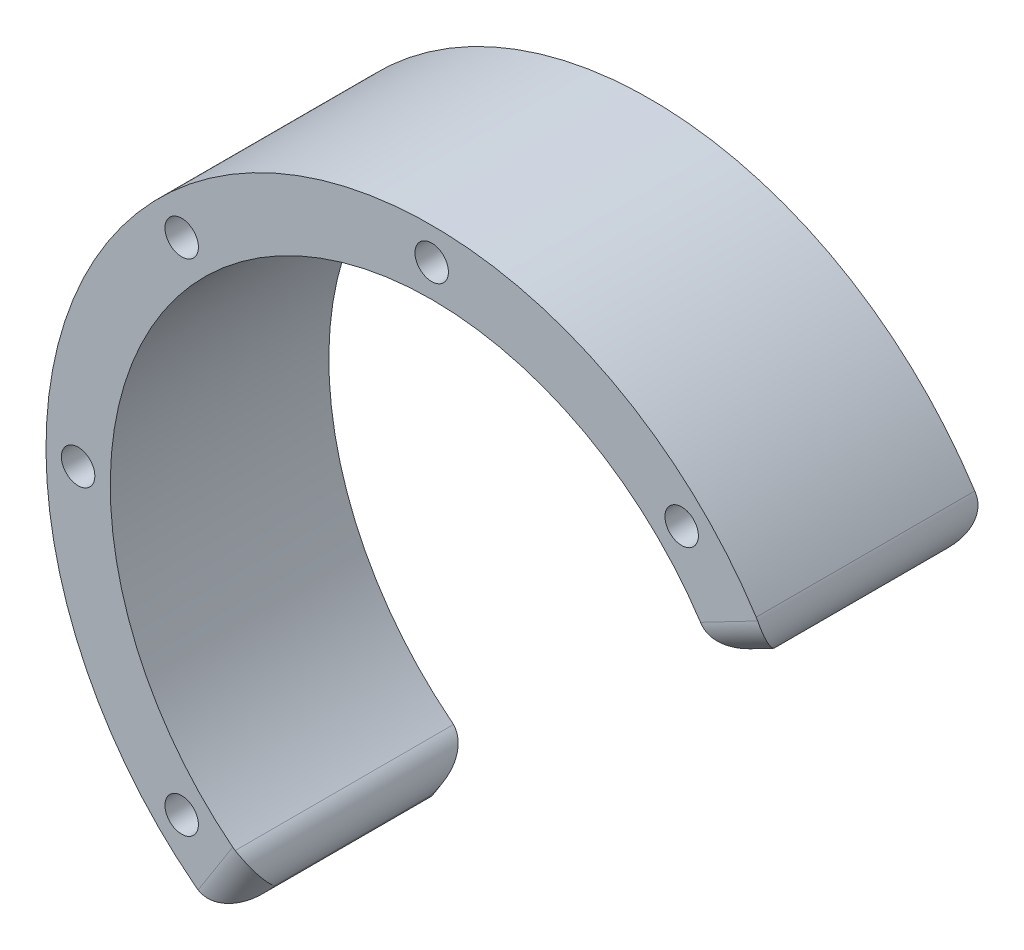
ISO-10303-21;
HEADER;
FILE_DESCRIPTION(('STEP AP214'),'2;1');
FILE_NAME('part.step','',(''),(''),'','','');
FILE_SCHEMA(('AUTOMOTIVE_DESIGN { 1 0 10303 214 1 1 1 1 }'));
ENDSEC;
DATA;
#1=APPLICATION_CONTEXT('core data for automotive mechanical design processes');
#2=APPLICATION_PROTOCOL_DEFINITION('international standard','automotive_design',2000,#1);
#3=PRODUCT_CONTEXT('',#1,'mechanical');
#4=PRODUCT('Part','Part','',(#3));
#5=PRODUCT_RELATED_PRODUCT_CATEGORY('part','',(#4));
#6=PRODUCT_DEFINITION_FORMATION('','',#4);
#7=PRODUCT_DEFINITION_CONTEXT('part definition',#1,'design');
#8=PRODUCT_DEFINITION('design','',#6,#7);
#9=PRODUCT_DEFINITION_SHAPE('','',#8);
#10=(LENGTH_UNIT() NAMED_UNIT(*) SI_UNIT(.MILLI.,.METRE.));
#11=(NAMED_UNIT(*) PLANE_ANGLE_UNIT() SI_UNIT($,.RADIAN.));
#12=(NAMED_UNIT(*) SI_UNIT($,.STERADIAN.) SOLID_ANGLE_UNIT());
#13=UNCERTAINTY_MEASURE_WITH_UNIT(LENGTH_MEASURE(1.E-05),#10,'distance_accuracy_value','');
#14=(GEOMETRIC_REPRESENTATION_CONTEXT(3) GLOBAL_UNCERTAINTY_ASSIGNED_CONTEXT((#13)) GLOBAL_UNIT_ASSIGNED_CONTEXT((#10,
#11,#12)) REPRESENTATION_CONTEXT('',''));
#15=CARTESIAN_POINT('',(0.,0.,0.));
#16=DIRECTION('',(0.,0.,1.));
#17=DIRECTION('',(1.,0.,0.));
#18=AXIS2_PLACEMENT_3D('',#15,#16,#17);
#19=CARTESIAN_POINT('',(0.,0.,34.));
#20=DIRECTION('',(0.,0.,1.));
#21=DIRECTION('',(1.,0.,0.));
#22=AXIS2_PLACEMENT_3D('',#19,#20,#21);
#23=PLANE('',#22);
#24=CARTESIAN_POINT('',(-55.,0.,34.));
#25=DIRECTION('',(0.,0.,1.));
#26=DIRECTION('',(1.,0.,0.));
#27=AXIS2_PLACEMENT_3D('',#24,#25,#26);
#28=CIRCLE('',#27,2.6);
#29=CARTESIAN_POINT('',(-52.4,0.,34.));
#30=VERTEX_POINT('',#29);
#31=EDGE_CURVE('E153',#30,#30,#28,.T.);
#32=ORIENTED_EDGE('',*,*,#31,.F.);
#33=EDGE_LOOP('',(#32));
#34=FACE_BOUND('',#33,.T.);
#35=CARTESIAN_POINT('',(0.,55.,34.));
#36=DIRECTION('',(0.,0.,1.));
#37=DIRECTION('',(1.,0.,0.));
#38=AXIS2_PLACEMENT_3D('',#35,#36,#37);
#39=CIRCLE('',#38,2.6);
#40=CARTESIAN_POINT('',(2.6,55.,34.));
#41=VERTEX_POINT('',#40);
#42=EDGE_CURVE('E177',#41,#41,#39,.T.);
#43=ORIENTED_EDGE('',*,*,#42,.F.);
#44=EDGE_LOOP('',(#43));
#45=FACE_BOUND('',#44,.T.);
#46=CARTESIAN_POINT('',(38.8908729652601,38.8908729652601,34.));
#47=DIRECTION('',(0.,0.,1.));
#48=DIRECTION('',(1.,0.,0.));
#49=AXIS2_PLACEMENT_3D('',#46,#47,#48);
#50=CIRCLE('',#49,2.6);
#51=CARTESIAN_POINT('',(41.4908729652601,38.8908729652601,34.));
#52=VERTEX_POINT('',#51);
#53=EDGE_CURVE('E169',#52,#52,#50,.T.);
#54=ORIENTED_EDGE('',*,*,#53,.F.);
#55=EDGE_LOOP('',(#54));
#56=FACE_BOUND('',#55,.T.);
#57=CARTESIAN_POINT('',(-38.8908729652601,-38.8908729652601,34.));
#58=DIRECTION('',(0.,0.,1.));
#59=DIRECTION('',(1.,0.,0.));
#60=AXIS2_PLACEMENT_3D('',#57,#58,#59);
#61=CIRCLE('',#60,2.6);
#62=CARTESIAN_POINT('',(-36.2908729652601,-38.8908729652601,34.));
#63=VERTEX_POINT('',#62);
#64=EDGE_CURVE('E161',#63,#63,#61,.T.);
#65=ORIENTED_EDGE('',*,*,#64,.F.);
#66=EDGE_LOOP('',(#65));
#67=FACE_BOUND('',#66,.T.);
#68=CARTESIAN_POINT('',(-38.8908729652601,38.8908729652601,34.));
#69=DIRECTION('',(0.,0.,1.));
#70=DIRECTION('',(1.,0.,0.));
#71=AXIS2_PLACEMENT_3D('',#68,#69,#70);
#72=CIRCLE('',#71,2.6);
#73=CARTESIAN_POINT('',(-36.2908729652601,38.8908729652601,34.));
#74=VERTEX_POINT('',#73);
#75=EDGE_CURVE('E145',#74,#74,#72,.T.);
#76=ORIENTED_EDGE('',*,*,#75,.F.);
#77=EDGE_LOOP('',(#76));
#78=FACE_BOUND('',#77,.T.);
#79=DIRECTION('',(0.887010833178223,0.461748613235032,0.));
#80=VECTOR('',#79,1.);
#81=CARTESIAN_POINT('',(-2.30874306617516,4.43505416589112,34.));
#82=LINE('',#81,#80);
#83=CARTESIAN_POINT('',(41.8194887133152,27.4067576294041,34.));
#84=VERTEX_POINT('',#83);
#85=CARTESIAN_POINT('',(50.7098953080324,32.0348103686218,34.));
#86=VERTEX_POINT('',#85);
#87=EDGE_CURVE('E197',#84,#86,#82,.T.);
#88=ORIENTED_EDGE('',*,*,#87,.T.);
#89=CARTESIAN_POINT('',(46.2748411421413,29.7260673024466,34.));
#90=DIRECTION('',(0.,0.,1.));
#91=DIRECTION('',(1.,0.,0.));
#92=AXIS2_PLACEMENT_3D('',#89,#90,#91);
#93=CIRCLE('',#92,5.);
#94=CARTESIAN_POINT('',(50.481644882336,32.4284370572145,34.));
#95=VERTEX_POINT('',#94);
#96=EDGE_CURVE('E201',#86,#95,#93,.T.);
#97=ORIENTED_EDGE('',*,*,#96,.T.);
#98=CARTESIAN_POINT('',(0.,0.,34.));
#99=DIRECTION('',(0.,0.,1.));
#100=DIRECTION('',(1.,0.,0.));
#101=AXIS2_PLACEMENT_3D('',#98,#99,#100);
#102=CIRCLE('',#101,60.);
#103=CARTESIAN_POINT('',(-36.7048023186427,-47.463222464866,34.));
#104=VERTEX_POINT('',#103);
#105=EDGE_CURVE('E185',#95,#104,#102,.T.);
#106=ORIENTED_EDGE('',*,*,#105,.T.);
#107=CARTESIAN_POINT('',(-33.6460687920891,-43.5079539261272,34.));
#108=DIRECTION('',(0.,0.,1.));
#109=DIRECTION('',(1.,0.,0.));
#110=AXIS2_PLACEMENT_3D('',#107,#108,#109);
#111=CIRCLE('',#110,5.);
#112=CARTESIAN_POINT('',(-36.3325668338233,-47.7249111551916,34.));
#113=VERTEX_POINT('',#112);
#114=EDGE_CURVE('E193',#104,#113,#111,.T.);
#115=ORIENTED_EDGE('',*,*,#114,.T.);
#116=DIRECTION('',(-0.537299608346825,-0.843391445812885,0.));
#117=VECTOR('',#116,1.);
#118=CARTESIAN_POINT('',(-31.0819376464057,-39.4830742489101,34.));
#119=LINE('',#118,#117);
#120=CARTESIAN_POINT('',(-30.9472752424343,-39.2716966156163,34.));
#121=VERTEX_POINT('',#120);
#122=EDGE_CURVE('E189',#113,#121,#119,.F.);
#123=ORIENTED_EDGE('',*,*,#122,.T.);
#124=CARTESIAN_POINT('',(0.,0.,34.));
#125=DIRECTION('',(0.,0.,1.));
#126=DIRECTION('',(1.,0.,0.));
#127=AXIS2_PLACEMENT_3D('',#124,#125,#126);
#128=CIRCLE('',#127,50.);
#129=EDGE_CURVE('E137',#84,#121,#128,.T.);
#130=ORIENTED_EDGE('',*,*,#129,.F.);
#131=EDGE_LOOP('',(#88,#97,#106,#115,#123,#130));
#132=FACE_BOUND('',#131,.T.);
#133=ADVANCED_FACE('F43',(#34,#45,#56,#67,#78,#132),#23,.T.);
#134=CARTESIAN_POINT('',(0.,0.,0.));
#135=DIRECTION('',(0.,0.,1.));
#136=DIRECTION('',(1.,0.,0.));
#137=AXIS2_PLACEMENT_3D('',#134,#135,#136);
#138=PLANE('',#137);
#139=CARTESIAN_POINT('',(-38.8908729652601,38.8908729652601,0.));
#140=DIRECTION('',(0.,0.,1.));
#141=DIRECTION('',(1.,0.,0.));
#142=AXIS2_PLACEMENT_3D('',#139,#140,#141);
#143=CIRCLE('',#142,2.6);
#144=CARTESIAN_POINT('',(-36.2908729652601,38.8908729652601,0.));
#145=VERTEX_POINT('',#144);
#146=EDGE_CURVE('E141',#145,#145,#143,.T.);
#147=ORIENTED_EDGE('',*,*,#146,.T.);
#148=EDGE_LOOP('',(#147));
#149=FACE_BOUND('',#148,.T.);
#150=CARTESIAN_POINT('',(-55.,0.,0.));
#151=DIRECTION('',(0.,0.,1.));
#152=DIRECTION('',(1.,0.,0.));
#153=AXIS2_PLACEMENT_3D('',#150,#151,#152);
#154=CIRCLE('',#153,2.6);
#155=CARTESIAN_POINT('',(-52.4,0.,0.));
#156=VERTEX_POINT('',#155);
#157=EDGE_CURVE('E149',#156,#156,#154,.T.);
#158=ORIENTED_EDGE('',*,*,#157,.T.);
#159=EDGE_LOOP('',(#158));
#160=FACE_BOUND('',#159,.T.);
#161=CARTESIAN_POINT('',(-38.8908729652601,-38.8908729652601,0.));
#162=DIRECTION('',(0.,0.,1.));
#163=DIRECTION('',(1.,0.,0.));
#164=AXIS2_PLACEMENT_3D('',#161,#162,#163);
#165=CIRCLE('',#164,2.6);
#166=CARTESIAN_POINT('',(-36.2908729652601,-38.8908729652601,0.));
#167=VERTEX_POINT('',#166);
#168=EDGE_CURVE('E157',#167,#167,#165,.T.);
#169=ORIENTED_EDGE('',*,*,#168,.T.);
#170=EDGE_LOOP('',(#169));
#171=FACE_BOUND('',#170,.T.);
#172=CARTESIAN_POINT('',(38.8908729652601,38.8908729652601,0.));
#173=DIRECTION('',(0.,0.,1.));
#174=DIRECTION('',(1.,0.,0.));
#175=AXIS2_PLACEMENT_3D('',#172,#173,#174);
#176=CIRCLE('',#175,2.6);
#177=CARTESIAN_POINT('',(41.4908729652601,38.8908729652601,0.));
#178=VERTEX_POINT('',#177);
#179=EDGE_CURVE('E165',#178,#178,#176,.T.);
#180=ORIENTED_EDGE('',*,*,#179,.T.);
#181=EDGE_LOOP('',(#180));
#182=FACE_BOUND('',#181,.T.);
#183=CARTESIAN_POINT('',(0.,55.,0.));
#184=DIRECTION('',(0.,0.,1.));
#185=DIRECTION('',(1.,0.,0.));
#186=AXIS2_PLACEMENT_3D('',#183,#184,#185);
#187=CIRCLE('',#186,2.6);
#188=CARTESIAN_POINT('',(2.6,55.,0.));
#189=VERTEX_POINT('',#188);
#190=EDGE_CURVE('E173',#189,#189,#187,.T.);
#191=ORIENTED_EDGE('',*,*,#190,.T.);
#192=EDGE_LOOP('',(#191));
#193=FACE_BOUND('',#192,.T.);
#194=CARTESIAN_POINT('',(0.,0.,0.));
#195=DIRECTION('',(0.,0.,1.));
#196=DIRECTION('',(1.,0.,0.));
#197=AXIS2_PLACEMENT_3D('',#194,#195,#196);
#198=CIRCLE('',#197,60.);
#199=CARTESIAN_POINT('',(50.481644882336,32.4284370572145,0.));
#200=VERTEX_POINT('',#199);
#201=CARTESIAN_POINT('',(-36.7048023186427,-47.463222464866,0.));
#202=VERTEX_POINT('',#201);
#203=EDGE_CURVE('E181',#200,#202,#198,.T.);
#204=ORIENTED_EDGE('',*,*,#203,.F.);
#205=CARTESIAN_POINT('',(46.2748411421413,29.7260673024466,0.));
#206=DIRECTION('',(0.,0.,1.));
#207=DIRECTION('',(1.,0.,0.));
#208=AXIS2_PLACEMENT_3D('',#205,#206,#207);
#209=CIRCLE('',#208,5.);
#210=CARTESIAN_POINT('',(50.7098953080324,32.0348103686218,0.));
#211=VERTEX_POINT('',#210);
#212=EDGE_CURVE('E223',#200,#211,#209,.F.);
#213=ORIENTED_EDGE('',*,*,#212,.T.);
#214=DIRECTION('',(0.887010833178223,0.461748613235032,0.));
#215=VECTOR('',#214,1.);
#216=CARTESIAN_POINT('',(42.041798592736,27.5224848276427,0.));
#217=LINE('',#216,#215);
#218=CARTESIAN_POINT('',(41.8194887133152,27.4067576294041,0.));
#219=VERTEX_POINT('',#218);
#220=EDGE_CURVE('E219',#211,#219,#217,.F.);
#221=ORIENTED_EDGE('',*,*,#220,.T.);
#222=CARTESIAN_POINT('',(0.,0.,0.));
#223=DIRECTION('',(0.,0.,1.));
#224=DIRECTION('',(1.,0.,0.));
#225=AXIS2_PLACEMENT_3D('',#222,#223,#224);
#226=CIRCLE('',#225,50.);
#227=CARTESIAN_POINT('',(-30.9472752424343,-39.2716966156163,0.));
#228=VERTEX_POINT('',#227);
#229=EDGE_CURVE('E134',#219,#228,#226,.T.);
#230=ORIENTED_EDGE('',*,*,#229,.T.);
#231=DIRECTION('',(-0.537299608346825,-0.843391445812885,0.));
#232=VECTOR('',#231,1.);
#233=CARTESIAN_POINT('',(-4.21695722906443,2.68649804173413,0.));
#234=LINE('',#233,#232);
#235=CARTESIAN_POINT('',(-36.3325668338233,-47.7249111551916,0.));
#236=VERTEX_POINT('',#235);
#237=EDGE_CURVE('E215',#228,#236,#234,.T.);
#238=ORIENTED_EDGE('',*,*,#237,.T.);
#239=CARTESIAN_POINT('',(-33.6460687920891,-43.5079539261272,0.));
#240=DIRECTION('',(0.,0.,1.));
#241=DIRECTION('',(1.,0.,0.));
#242=AXIS2_PLACEMENT_3D('',#239,#240,#241);
#243=CIRCLE('',#242,5.);
#244=EDGE_CURVE('E94',#236,#202,#243,.F.);
#245=ORIENTED_EDGE('',*,*,#244,.T.);
#246=EDGE_LOOP('',(#204,#213,#221,#230,#238,#245));
#247=FACE_BOUND('',#246,.T.);
#248=ADVANCED_FACE('F285',(#149,#160,#171,#182,#193,#247),#138,.F.);
#249=CARTESIAN_POINT('',(0.,0.,34.));
#250=DIRECTION('',(0.,0.,-1.));
#251=DIRECTION('',(-1.,0.,0.));
#252=AXIS2_PLACEMENT_3D('',#249,#250,#251);
#253=CYLINDRICAL_SURFACE('',#252,60.);
#254=ORIENTED_EDGE('',*,*,#105,.F.);
#255=DIRECTION('',(0.,0.,-1.));
#256=VECTOR('',#255,1.);
#257=CARTESIAN_POINT('',(50.481644882336,32.4284370572145,34.));
#258=LINE('',#257,#256);
#259=EDGE_CURVE('E209',#95,#200,#258,.T.);
#260=ORIENTED_EDGE('',*,*,#259,.T.);
#261=ORIENTED_EDGE('',*,*,#203,.T.);
#262=DIRECTION('',(0.,0.,-1.));
#263=VECTOR('',#262,1.);
#264=CARTESIAN_POINT('',(-36.7048023186427,-47.463222464866,34.));
#265=LINE('',#264,#263);
#266=EDGE_CURVE('E205',#202,#104,#265,.F.);
#267=ORIENTED_EDGE('',*,*,#266,.T.);
#268=EDGE_LOOP('',(#254,#260,#261,#267));
#269=FACE_BOUND('',#268,.T.);
#270=ADVANCED_FACE('F291',(#269),#253,.T.);
#271=CARTESIAN_POINT('',(0.,0.,34.));
#272=DIRECTION('',(0.,0.,-1.));
#273=DIRECTION('',(-1.,0.,0.));
#274=AXIS2_PLACEMENT_3D('',#271,#272,#273);
#275=CYLINDRICAL_SURFACE('',#274,50.);
#276=ORIENTED_EDGE('',*,*,#229,.F.);
#277=CARTESIAN_POINT('',(41.8194887133152,27.4067576294041,0.));
#278=CARTESIAN_POINT('',(41.8612901800064,27.3429722010852,2.14972934672392E-07));
#279=CARTESIAN_POINT('',(41.9029033040713,27.2791578134486,0.00172565768276104));
#280=CARTESIAN_POINT('',(41.9857528669484,27.1514711195402,0.00862699857619721));
#281=CARTESIAN_POINT('',(42.0269893057607,27.0875988132683,0.013802896759807));
#282=CARTESIAN_POINT('',(42.0680374019466,27.0236975476788,0.0207040226803085));
#283=B_SPLINE_CURVE_WITH_KNOTS('',3,(#277,#278,#279,#280,#281,#282),.UNSPECIFIED.,.F.,.F.,(4,2,
4),(0.,0.228609159588418,0.457218319176838),.UNSPECIFIED.);
#284=CARTESIAN_POINT('',(42.0680374019466,27.0236975476788,0.0207040226803054));
#285=VERTEX_POINT('',#284);
#286=EDGE_CURVE('E11',#219,#285,#283,.T.);
#287=ORIENTED_EDGE('',*,*,#286,.T.);
#288=DIRECTION('',(0.,0.,-1.));
#289=VECTOR('',#288,1.);
#290=CARTESIAN_POINT('',(42.0680374019466,27.0236975476788,34.));
#291=LINE('',#290,#289);
#292=CARTESIAN_POINT('',(42.0680374019466,27.0236975476788,33.9792959773197));
#293=VERTEX_POINT('',#292);
#294=EDGE_CURVE('E55',#285,#293,#291,.F.);
#295=ORIENTED_EDGE('',*,*,#294,.T.);
#296=CARTESIAN_POINT('',(42.0680374019466,27.0236975476788,33.9792959773197));
#297=CARTESIAN_POINT('',(42.0269893057607,27.0875988132683,33.9861971032402));
#298=CARTESIAN_POINT('',(41.9857528669484,27.1514711195402,33.9913730014238));
#299=CARTESIAN_POINT('',(41.9029033040713,27.2791578134486,33.9982743423172));
#300=CARTESIAN_POINT('',(41.8612901800064,27.3429722010852,33.9999997850271));
#301=CARTESIAN_POINT('',(41.8194887133152,27.4067576294041,34.));
#302=B_SPLINE_CURVE_WITH_KNOTS('',3,(#296,#297,#298,#299,#300,#301),.UNSPECIFIED.,.F.,.F.,(4,2,
4),(0.,0.228609159588422,0.457218319176837),.UNSPECIFIED.);
#303=EDGE_CURVE('E236',#293,#84,#302,.T.);
#304=ORIENTED_EDGE('',*,*,#303,.T.);
#305=ORIENTED_EDGE('',*,*,#129,.T.);
#306=CARTESIAN_POINT('',(-30.9472752424343,-39.2716966156163,34.));
#307=CARTESIAN_POINT('',(-30.8873757748049,-39.3188982814882,33.9999997850271));
#308=CARTESIAN_POINT('',(-30.8274310429153,-39.3659148454051,33.9982743423172));
#309=CARTESIAN_POINT('',(-30.7074510506157,-39.4595777693291,33.9913730014238));
#310=CARTESIAN_POINT('',(-30.6474157902058,-39.5062241293362,33.9861971032402));
#311=CARTESIAN_POINT('',(-30.5873352655356,-39.5526853873884,33.9792959773197));
#312=B_SPLINE_CURVE_WITH_KNOTS('',3,(#306,#307,#308,#309,#310,#311),.UNSPECIFIED.,.F.,.F.,(4,2,
4),(0.,0.228609159588411,0.457218319176824),.UNSPECIFIED.);
#313=CARTESIAN_POINT('',(-30.5873352655356,-39.5526853873884,33.9792959773197));
#314=VERTEX_POINT('',#313);
#315=EDGE_CURVE('E227',#121,#314,#312,.T.);
#316=ORIENTED_EDGE('',*,*,#315,.T.);
#317=DIRECTION('',(0.,0.,-1.));
#318=VECTOR('',#317,1.);
#319=CARTESIAN_POINT('',(-30.5873352655356,-39.5526853873884,34.));
#320=LINE('',#319,#318);
#321=CARTESIAN_POINT('',(-30.5873352655356,-39.5526853873884,0.0207040226803054));
#322=VERTEX_POINT('',#321);
#323=EDGE_CURVE('E231',#314,#322,#320,.T.);
#324=ORIENTED_EDGE('',*,*,#323,.T.);
#325=CARTESIAN_POINT('',(-30.5873352655356,-39.5526853873884,0.0207040226803054));
#326=CARTESIAN_POINT('',(-30.6474157902058,-39.5062241293362,0.0138028967598049));
#327=CARTESIAN_POINT('',(-30.7074510506157,-39.4595777693291,0.00862699857619582));
#328=CARTESIAN_POINT('',(-30.8274310429153,-39.3659148454051,0.00172565768276055));
#329=CARTESIAN_POINT('',(-30.8873757748049,-39.3188982814882,2.14972934325914E-07));
#330=CARTESIAN_POINT('',(-30.9472752424343,-39.2716966156163,0.));
#331=B_SPLINE_CURVE_WITH_KNOTS('',3,(#325,#326,#327,#328,#329,#330),.UNSPECIFIED.,.F.,.F.,(4,2,
4),(0.,0.228609159588417,0.457218319176832),.UNSPECIFIED.);
#332=EDGE_CURVE('E103',#322,#228,#331,.T.);
#333=ORIENTED_EDGE('',*,*,#332,.T.);
#334=EDGE_LOOP('',(#276,#287,#295,#304,#305,#316,#324,#333));
#335=FACE_BOUND('',#334,.T.);
#336=ADVANCED_FACE('F255',(#335),#275,.F.);
#337=CARTESIAN_POINT('',(0.,55.,34.));
#338=DIRECTION('',(0.,0.,-1.));
#339=DIRECTION('',(-1.,0.,0.));
#340=AXIS2_PLACEMENT_3D('',#337,#338,#339);
#341=CYLINDRICAL_SURFACE('',#340,2.6);
#342=ORIENTED_EDGE('',*,*,#42,.T.);
#343=EDGE_LOOP('',(#342));
#344=FACE_BOUND('',#343,.T.);
#345=ORIENTED_EDGE('',*,*,#190,.F.);
#346=EDGE_LOOP('',(#345));
#347=FACE_BOUND('',#346,.T.);
#348=ADVANCED_FACE('F297',(#344,#347),#341,.F.);
#349=CARTESIAN_POINT('',(38.8908729652601,38.8908729652601,34.));
#350=DIRECTION('',(0.,0.,-1.));
#351=DIRECTION('',(-1.,0.,0.));
#352=AXIS2_PLACEMENT_3D('',#349,#350,#351);
#353=CYLINDRICAL_SURFACE('',#352,2.6);
#354=ORIENTED_EDGE('',*,*,#53,.T.);
#355=EDGE_LOOP('',(#354));
#356=FACE_BOUND('',#355,.T.);
#357=ORIENTED_EDGE('',*,*,#179,.F.);
#358=EDGE_LOOP('',(#357));
#359=FACE_BOUND('',#358,.T.);
#360=ADVANCED_FACE('F357',(#356,#359),#353,.F.);
#361=CARTESIAN_POINT('',(-38.8908729652601,-38.8908729652601,34.));
#362=DIRECTION('',(0.,0.,-1.));
#363=DIRECTION('',(-1.,0.,0.));
#364=AXIS2_PLACEMENT_3D('',#361,#362,#363);
#365=CYLINDRICAL_SURFACE('',#364,2.6);
#366=ORIENTED_EDGE('',*,*,#64,.T.);
#367=EDGE_LOOP('',(#366));
#368=FACE_BOUND('',#367,.T.);
#369=ORIENTED_EDGE('',*,*,#168,.F.);
#370=EDGE_LOOP('',(#369));
#371=FACE_BOUND('',#370,.T.);
#372=ADVANCED_FACE('F362',(#368,#371),#365,.F.);
#373=CARTESIAN_POINT('',(-55.,0.,34.));
#374=DIRECTION('',(0.,0.,-1.));
#375=DIRECTION('',(-1.,0.,0.));
#376=AXIS2_PLACEMENT_3D('',#373,#374,#375);
#377=CYLINDRICAL_SURFACE('',#376,2.6);
#378=ORIENTED_EDGE('',*,*,#31,.T.);
#379=EDGE_LOOP('',(#378));
#380=FACE_BOUND('',#379,.T.);
#381=ORIENTED_EDGE('',*,*,#157,.F.);
#382=EDGE_LOOP('',(#381));
#383=FACE_BOUND('',#382,.T.);
#384=ADVANCED_FACE('F377',(#380,#383),#377,.F.);
#385=CARTESIAN_POINT('',(-38.8908729652601,38.8908729652601,34.));
#386=DIRECTION('',(0.,0.,-1.));
#387=DIRECTION('',(-1.,0.,0.));
#388=AXIS2_PLACEMENT_3D('',#385,#386,#387);
#389=CYLINDRICAL_SURFACE('',#388,2.6);
#390=ORIENTED_EDGE('',*,*,#75,.T.);
#391=EDGE_LOOP('',(#390));
#392=FACE_BOUND('',#391,.T.);
#393=ORIENTED_EDGE('',*,*,#146,.F.);
#394=EDGE_LOOP('',(#393));
#395=FACE_BOUND('',#394,.T.);
#396=ADVANCED_FACE('F264',(#392,#395),#389,.F.);
#397=CARTESIAN_POINT('',(-2.30874306617516,4.43505416589112,5.));
#398=DIRECTION('',(-0.887010833178223,-0.461748613235032,0.));
#399=DIRECTION('',(0.461748613235032,-0.887010833178223,0.));
#400=AXIS2_PLACEMENT_3D('',#397,#398,#399);
#401=CYLINDRICAL_SURFACE('',#400,5.);
#402=CARTESIAN_POINT('',(46.2748411421413,29.7260673024466,5.));
#403=DIRECTION('',(0.627211375126251,0.326505575621975,-0.707106781186547));
#404=DIRECTION('',(-0.627211375126251,-0.326505575621975,-0.707106781186547));
#405=AXIS2_PLACEMENT_3D('',#402,#403,#404);
#406=ELLIPSE('',#405,7.07106781186547,5.);
#407=CARTESIAN_POINT('',(48.5835842083165,25.2910131365555,5.));
#408=VERTEX_POINT('',#407);
#409=EDGE_CURVE('E131',#285,#408,#406,.F.);
#410=ORIENTED_EDGE('',*,*,#409,.F.);
#411=ORIENTED_EDGE('',*,*,#286,.F.);
#412=ORIENTED_EDGE('',*,*,#220,.F.);
#413=CARTESIAN_POINT('',(46.2748411421413,29.7260673024466,5.));
#414=DIRECTION('',(-0.627211375126251,-0.326505575621975,-0.707106781186547));
#415=DIRECTION('',(-0.627211375126251,-0.326505575621975,0.707106781186547));
#416=AXIS2_PLACEMENT_3D('',#413,#414,#415);
#417=ELLIPSE('',#416,7.07106781186547,5.);
#418=EDGE_CURVE('E124',#408,#211,#417,.F.);
#419=ORIENTED_EDGE('',*,*,#418,.F.);
#420=EDGE_LOOP('',(#410,#411,#412,#419));
#421=FACE_BOUND('',#420,.T.);
#422=ADVANCED_FACE('F258',(#421),#401,.T.);
#423=CARTESIAN_POINT('',(46.2748411421413,29.7260673024466,34.));
#424=DIRECTION('',(0.,0.,-1.));
#425=DIRECTION('',(-1.,0.,0.));
#426=AXIS2_PLACEMENT_3D('',#423,#424,#425);
#427=CYLINDRICAL_SURFACE('',#426,5.);
#428=CARTESIAN_POINT('',(46.2748411421413,29.7260673024466,29.));
#429=DIRECTION('',(0.627211375126251,0.326505575621975,0.707106781186547));
#430=DIRECTION('',(0.627211375126251,0.326505575621975,-0.707106781186547));
#431=AXIS2_PLACEMENT_3D('',#428,#429,#430);
#432=ELLIPSE('',#431,7.07106781186547,5.);
#433=CARTESIAN_POINT('',(48.5835842083165,25.2910131365555,29.));
#434=VERTEX_POINT('',#433);
#435=EDGE_CURVE('E128',#293,#434,#432,.T.);
#436=ORIENTED_EDGE('',*,*,#435,.F.);
#437=ORIENTED_EDGE('',*,*,#294,.F.);
#438=ORIENTED_EDGE('',*,*,#409,.T.);
#439=DIRECTION('',(0.,0.,-1.));
#440=VECTOR('',#439,1.);
#441=CARTESIAN_POINT('',(48.5835842083165,25.2910131365555,0.));
#442=LINE('',#441,#440);
#443=EDGE_CURVE('E120',#434,#408,#442,.T.);
#444=ORIENTED_EDGE('',*,*,#443,.F.);
#445=EDGE_LOOP('',(#436,#437,#438,#444));
#446=FACE_BOUND('',#445,.T.);
#447=ADVANCED_FACE('F263',(#446),#427,.T.);
#448=CARTESIAN_POINT('',(-2.30874306617516,4.43505416589112,29.));
#449=DIRECTION('',(0.887010833178223,0.461748613235032,0.));
#450=DIRECTION('',(-0.461748613235032,0.887010833178223,0.));
#451=AXIS2_PLACEMENT_3D('',#448,#449,#450);
#452=CYLINDRICAL_SURFACE('',#451,5.);
#453=ORIENTED_EDGE('',*,*,#303,.F.);
#454=ORIENTED_EDGE('',*,*,#435,.T.);
#455=CARTESIAN_POINT('',(46.2748411421413,29.7260673024466,29.));
#456=DIRECTION('',(0.627211375126251,0.326505575621975,-0.707106781186547));
#457=DIRECTION('',(0.627211375126251,0.326505575621975,0.707106781186547));
#458=AXIS2_PLACEMENT_3D('',#455,#456,#457);
#459=ELLIPSE('',#458,7.07106781186547,5.);
#460=EDGE_CURVE('E98',#86,#434,#459,.T.);
#461=ORIENTED_EDGE('',*,*,#460,.F.);
#462=ORIENTED_EDGE('',*,*,#87,.F.);
#463=EDGE_LOOP('',(#453,#454,#461,#462));
#464=FACE_BOUND('',#463,.T.);
#465=ADVANCED_FACE('F304',(#464),#452,.T.);
#466=CARTESIAN_POINT('',(46.2748411421413,29.7260673024466,34.));
#467=DIRECTION('',(0.,0.,-1.));
#468=DIRECTION('',(-1.,0.,0.));
#469=AXIS2_PLACEMENT_3D('',#466,#467,#468);
#470=CYLINDRICAL_SURFACE('',#469,5.);
#471=ORIENTED_EDGE('',*,*,#212,.F.);
#472=ORIENTED_EDGE('',*,*,#259,.F.);
#473=ORIENTED_EDGE('',*,*,#96,.F.);
#474=ORIENTED_EDGE('',*,*,#460,.T.);
#475=ORIENTED_EDGE('',*,*,#443,.T.);
#476=ORIENTED_EDGE('',*,*,#418,.T.);
#477=EDGE_LOOP('',(#471,#472,#473,#474,#475,#476));
#478=FACE_BOUND('',#477,.T.);
#479=ADVANCED_FACE('F283',(#478),#470,.T.);
#480=CARTESIAN_POINT('',(-4.21695722906443,2.68649804173413,5.));
#481=DIRECTION('',(-0.537299608346825,-0.843391445812885,0.));
#482=DIRECTION('',(0.843391445812885,-0.537299608346825,0.));
#483=AXIS2_PLACEMENT_3D('',#480,#481,#482);
#484=CYLINDRICAL_SURFACE('',#483,5.);
#485=CARTESIAN_POINT('',(-33.6460687920891,-43.5079539261272,5.));
#486=DIRECTION('',(0.379928196590916,0.596367810529018,-0.707106781186547));
#487=DIRECTION('',(-0.379928196590916,-0.596367810529018,-0.707106781186547));
#488=AXIS2_PLACEMENT_3D('',#485,#486,#487);
#489=ELLIPSE('',#488,7.07106781186547,5.);
#490=CARTESIAN_POINT('',(-29.4291115630247,-46.1944519678613,5.));
#491=VERTEX_POINT('',#490);
#492=EDGE_CURVE('E48',#236,#491,#489,.F.);
#493=ORIENTED_EDGE('',*,*,#492,.F.);
#494=ORIENTED_EDGE('',*,*,#237,.F.);
#495=ORIENTED_EDGE('',*,*,#332,.F.);
#496=CARTESIAN_POINT('',(-33.6460687920891,-43.5079539261272,5.));
#497=DIRECTION('',(-0.379928196590916,-0.596367810529018,-0.707106781186547));
#498=DIRECTION('',(-0.379928196590916,-0.596367810529018,0.707106781186547));
#499=AXIS2_PLACEMENT_3D('',#496,#497,#498);
#500=ELLIPSE('',#499,7.07106781186547,5.);
#501=EDGE_CURVE('E101',#491,#322,#500,.F.);
#502=ORIENTED_EDGE('',*,*,#501,.F.);
#503=EDGE_LOOP('',(#493,#494,#495,#502));
#504=FACE_BOUND('',#503,.T.);
#505=ADVANCED_FACE('F45',(#504),#484,.T.);
#506=CARTESIAN_POINT('',(-33.6460687920891,-43.5079539261272,34.));
#507=DIRECTION('',(0.,0.,-1.));
#508=DIRECTION('',(-1.,0.,0.));
#509=AXIS2_PLACEMENT_3D('',#506,#507,#508);
#510=CYLINDRICAL_SURFACE('',#509,5.);
#511=CARTESIAN_POINT('',(-33.6460687920891,-43.5079539261272,29.));
#512=DIRECTION('',(0.379928196590916,0.596367810529018,0.707106781186547));
#513=DIRECTION('',(0.379928196590916,0.596367810529018,-0.707106781186547));
#514=AXIS2_PLACEMENT_3D('',#511,#512,#513);
#515=ELLIPSE('',#514,7.07106781186547,5.);
#516=CARTESIAN_POINT('',(-29.4291115630247,-46.1944519678613,29.));
#517=VERTEX_POINT('',#516);
#518=EDGE_CURVE('E80',#113,#517,#515,.T.);
#519=ORIENTED_EDGE('',*,*,#518,.F.);
#520=ORIENTED_EDGE('',*,*,#114,.F.);
#521=ORIENTED_EDGE('',*,*,#266,.F.);
#522=ORIENTED_EDGE('',*,*,#244,.F.);
#523=ORIENTED_EDGE('',*,*,#492,.T.);
#524=DIRECTION('',(0.,0.,-1.));
#525=VECTOR('',#524,1.);
#526=CARTESIAN_POINT('',(-29.4291115630247,-46.1944519678613,0.));
#527=LINE('',#526,#525);
#528=EDGE_CURVE('E89',#517,#491,#527,.T.);
#529=ORIENTED_EDGE('',*,*,#528,.F.);
#530=EDGE_LOOP('',(#519,#520,#521,#522,#523,#529));
#531=FACE_BOUND('',#530,.T.);
#532=ADVANCED_FACE('F87',(#531),#510,.T.);
#533=CARTESIAN_POINT('',(-4.21695722906443,2.68649804173412,29.));
#534=DIRECTION('',(0.537299608346825,0.843391445812885,0.));
#535=DIRECTION('',(-0.843391445812885,0.537299608346825,0.));
#536=AXIS2_PLACEMENT_3D('',#533,#534,#535);
#537=CYLINDRICAL_SURFACE('',#536,5.);
#538=ORIENTED_EDGE('',*,*,#122,.F.);
#539=ORIENTED_EDGE('',*,*,#518,.T.);
#540=CARTESIAN_POINT('',(-33.6460687920891,-43.5079539261272,29.));
#541=DIRECTION('',(0.379928196590916,0.596367810529018,-0.707106781186547));
#542=DIRECTION('',(0.379928196590916,0.596367810529018,0.707106781186547));
#543=AXIS2_PLACEMENT_3D('',#540,#541,#542);
#544=ELLIPSE('',#543,7.07106781186547,5.);
#545=EDGE_CURVE('E110',#314,#517,#544,.T.);
#546=ORIENTED_EDGE('',*,*,#545,.F.);
#547=ORIENTED_EDGE('',*,*,#315,.F.);
#548=EDGE_LOOP('',(#538,#539,#546,#547));
#549=FACE_BOUND('',#548,.T.);
#550=ADVANCED_FACE('F268',(#549),#537,.T.);
#551=CARTESIAN_POINT('',(-33.6460687920891,-43.5079539261272,34.));
#552=DIRECTION('',(0.,0.,-1.));
#553=DIRECTION('',(-1.,0.,0.));
#554=AXIS2_PLACEMENT_3D('',#551,#552,#553);
#555=CYLINDRICAL_SURFACE('',#554,5.);
#556=ORIENTED_EDGE('',*,*,#501,.T.);
#557=ORIENTED_EDGE('',*,*,#323,.F.);
#558=ORIENTED_EDGE('',*,*,#545,.T.);
#559=ORIENTED_EDGE('',*,*,#528,.T.);
#560=EDGE_LOOP('',(#556,#557,#558,#559));
#561=FACE_BOUND('',#560,.T.);
#562=ADVANCED_FACE('F109',(#561),#555,.T.);
#563=CLOSED_SHELL('',(#133,#248,#270,#336,#348,#360,#372,#384,#396,#422,#447,#465,#479,#505,
#532,#550,#562));
#564=MANIFOLD_SOLID_BREP('B2',#563);
#565=ADVANCED_BREP_SHAPE_REPRESENTATION('',(#18,#564),#14);
#566=SHAPE_DEFINITION_REPRESENTATION(#9,#565);
ENDSEC;
END-ISO-10303-21;
